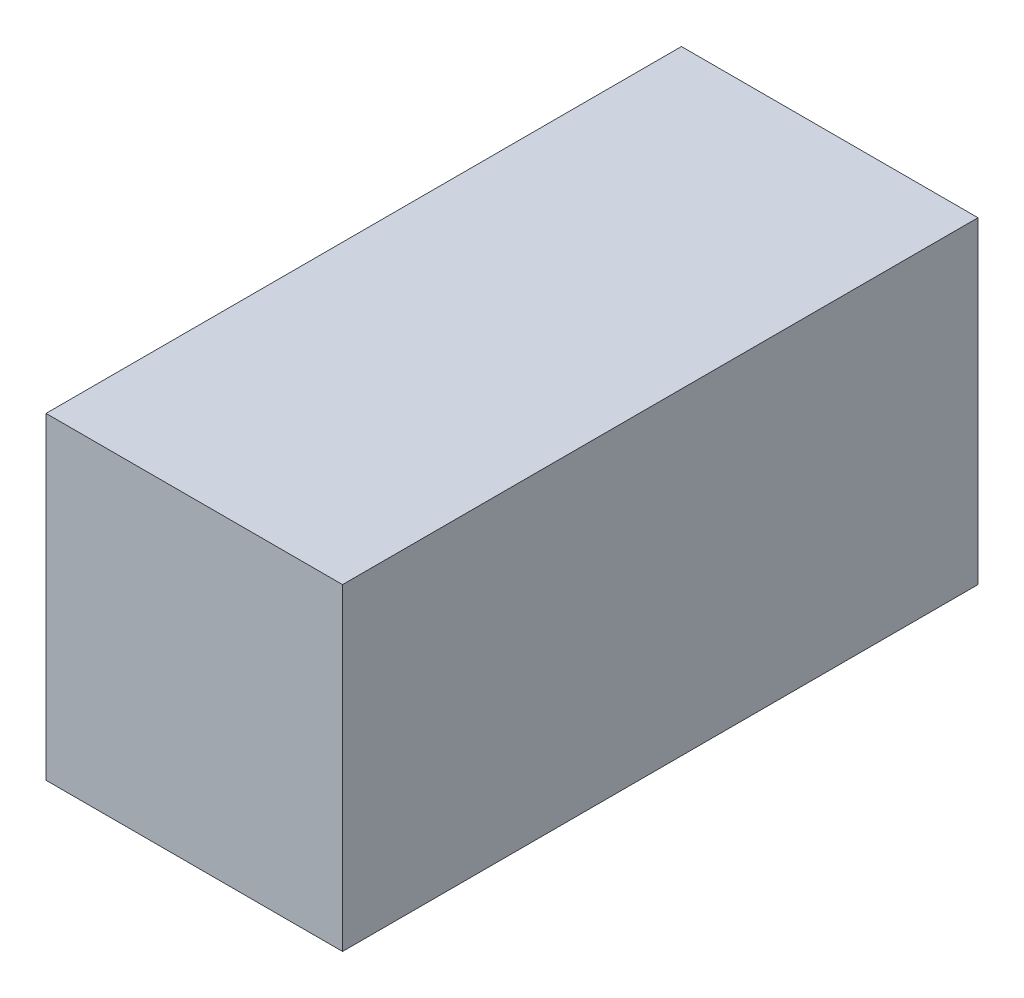
ISO-10303-21;
HEADER;
FILE_DESCRIPTION(('STEP AP214'),'2;1');
FILE_NAME('part.step','',(''),(''),'','','');
FILE_SCHEMA(('AUTOMOTIVE_DESIGN { 1 0 10303 214 1 1 1 1 }'));
ENDSEC;
DATA;
#1=APPLICATION_CONTEXT('core data for automotive mechanical design processes');
#2=APPLICATION_PROTOCOL_DEFINITION('international standard','automotive_design',2000,#1);
#3=PRODUCT_CONTEXT('',#1,'mechanical');
#4=PRODUCT('Part','Part','',(#3));
#5=PRODUCT_RELATED_PRODUCT_CATEGORY('part','',(#4));
#6=PRODUCT_DEFINITION_FORMATION('','',#4);
#7=PRODUCT_DEFINITION_CONTEXT('part definition',#1,'design');
#8=PRODUCT_DEFINITION('design','',#6,#7);
#9=PRODUCT_DEFINITION_SHAPE('','',#8);
#10=(LENGTH_UNIT() NAMED_UNIT(*) SI_UNIT(.MILLI.,.METRE.));
#11=(NAMED_UNIT(*) PLANE_ANGLE_UNIT() SI_UNIT($,.RADIAN.));
#12=(NAMED_UNIT(*) SI_UNIT($,.STERADIAN.) SOLID_ANGLE_UNIT());
#13=UNCERTAINTY_MEASURE_WITH_UNIT(LENGTH_MEASURE(1.E-05),#10,'distance_accuracy_value','');
#14=(GEOMETRIC_REPRESENTATION_CONTEXT(3) GLOBAL_UNCERTAINTY_ASSIGNED_CONTEXT((#13)) GLOBAL_UNIT_ASSIGNED_CONTEXT((#10,
#11,#12)) REPRESENTATION_CONTEXT('',''));
#15=CARTESIAN_POINT('',(0.,0.,0.));
#16=DIRECTION('',(0.,0.,1.));
#17=DIRECTION('',(1.,0.,0.));
#18=AXIS2_PLACEMENT_3D('',#15,#16,#17);
#19=CARTESIAN_POINT('',(230.,405.,-400.));
#20=DIRECTION('',(-1.,0.,0.));
#21=DIRECTION('',(0.,0.,1.));
#22=AXIS2_PLACEMENT_3D('',#19,#20,#21);
#23=PLANE('',#22);
#24=DIRECTION('',(0.,-1.,0.));
#25=VECTOR('',#24,1.);
#26=CARTESIAN_POINT('',(230.,405.,-100.));
#27=LINE('',#26,#25);
#28=CARTESIAN_POINT('',(230.,555.,-100.));
#29=VERTEX_POINT('',#28);
#30=CARTESIAN_POINT('',(230.,405.,-100.));
#31=VERTEX_POINT('',#30);
#32=EDGE_CURVE('E103',#29,#31,#27,.T.);
#33=ORIENTED_EDGE('',*,*,#32,.F.);
#34=DIRECTION('',(0.,0.,1.));
#35=VECTOR('',#34,1.);
#36=CARTESIAN_POINT('',(230.,555.,-400.));
#37=LINE('',#36,#35);
#38=CARTESIAN_POINT('',(230.,555.,-400.));
#39=VERTEX_POINT('',#38);
#40=EDGE_CURVE('E11',#39,#29,#37,.T.);
#41=ORIENTED_EDGE('',*,*,#40,.F.);
#42=DIRECTION('',(0.,-1.,0.));
#43=VECTOR('',#42,1.);
#44=CARTESIAN_POINT('',(230.,405.,-400.));
#45=LINE('',#44,#43);
#46=CARTESIAN_POINT('',(230.,405.,-400.));
#47=VERTEX_POINT('',#46);
#48=EDGE_CURVE('E97',#39,#47,#45,.T.);
#49=ORIENTED_EDGE('',*,*,#48,.T.);
#50=DIRECTION('',(0.,0.,1.));
#51=VECTOR('',#50,1.);
#52=CARTESIAN_POINT('',(230.,405.,-400.));
#53=LINE('',#52,#51);
#54=EDGE_CURVE('E42',#47,#31,#53,.T.);
#55=ORIENTED_EDGE('',*,*,#54,.T.);
#56=EDGE_LOOP('',(#33,#41,#49,#55));
#57=FACE_BOUND('',#56,.T.);
#58=ADVANCED_FACE('F39',(#57),#23,.T.);
#59=CARTESIAN_POINT('',(230.,555.,-400.));
#60=DIRECTION('',(0.,1.,0.));
#61=DIRECTION('',(0.,0.,1.));
#62=AXIS2_PLACEMENT_3D('',#59,#60,#61);
#63=PLANE('',#62);
#64=DIRECTION('',(-1.,0.,0.));
#65=VECTOR('',#64,1.);
#66=CARTESIAN_POINT('',(230.,555.,-100.));
#67=LINE('',#66,#65);
#68=CARTESIAN_POINT('',(370.,555.,-100.));
#69=VERTEX_POINT('',#68);
#70=EDGE_CURVE('E99',#69,#29,#67,.T.);
#71=ORIENTED_EDGE('',*,*,#70,.F.);
#72=DIRECTION('',(0.,0.,1.));
#73=VECTOR('',#72,1.);
#74=CARTESIAN_POINT('',(370.,555.,-400.));
#75=LINE('',#74,#73);
#76=CARTESIAN_POINT('',(370.,555.,-400.));
#77=VERTEX_POINT('',#76);
#78=EDGE_CURVE('E48',#77,#69,#75,.T.);
#79=ORIENTED_EDGE('',*,*,#78,.F.);
#80=DIRECTION('',(-1.,0.,0.));
#81=VECTOR('',#80,1.);
#82=CARTESIAN_POINT('',(230.,555.,-400.));
#83=LINE('',#82,#81);
#84=EDGE_CURVE('E94',#77,#39,#83,.T.);
#85=ORIENTED_EDGE('',*,*,#84,.T.);
#86=ORIENTED_EDGE('',*,*,#40,.T.);
#87=EDGE_LOOP('',(#71,#79,#85,#86));
#88=FACE_BOUND('',#87,.T.);
#89=ADVANCED_FACE('F113',(#88),#63,.T.);
#90=CARTESIAN_POINT('',(370.,405.,-400.));
#91=DIRECTION('',(1.,0.,0.));
#92=DIRECTION('',(0.,0.,-1.));
#93=AXIS2_PLACEMENT_3D('',#90,#91,#92);
#94=PLANE('',#93);
#95=DIRECTION('',(0.,1.,0.));
#96=VECTOR('',#95,1.);
#97=CARTESIAN_POINT('',(370.,405.,-100.));
#98=LINE('',#97,#96);
#99=CARTESIAN_POINT('',(370.,405.,-100.));
#100=VERTEX_POINT('',#99);
#101=EDGE_CURVE('E89',#100,#69,#98,.T.);
#102=ORIENTED_EDGE('',*,*,#101,.F.);
#103=DIRECTION('',(0.,0.,1.));
#104=VECTOR('',#103,1.);
#105=CARTESIAN_POINT('',(370.,405.,-400.));
#106=LINE('',#105,#104);
#107=CARTESIAN_POINT('',(370.,405.,-400.));
#108=VERTEX_POINT('',#107);
#109=EDGE_CURVE('E84',#108,#100,#106,.T.);
#110=ORIENTED_EDGE('',*,*,#109,.F.);
#111=DIRECTION('',(0.,1.,0.));
#112=VECTOR('',#111,1.);
#113=CARTESIAN_POINT('',(370.,405.,-400.));
#114=LINE('',#113,#112);
#115=EDGE_CURVE('E87',#108,#77,#114,.T.);
#116=ORIENTED_EDGE('',*,*,#115,.T.);
#117=ORIENTED_EDGE('',*,*,#78,.T.);
#118=EDGE_LOOP('',(#102,#110,#116,#117));
#119=FACE_BOUND('',#118,.T.);
#120=ADVANCED_FACE('F86',(#119),#94,.T.);
#121=CARTESIAN_POINT('',(230.,405.,-400.));
#122=DIRECTION('',(0.,-1.,0.));
#123=DIRECTION('',(0.,0.,-1.));
#124=AXIS2_PLACEMENT_3D('',#121,#122,#123);
#125=PLANE('',#124);
#126=DIRECTION('',(1.,0.,0.));
#127=VECTOR('',#126,1.);
#128=CARTESIAN_POINT('',(230.,405.,-100.));
#129=LINE('',#128,#127);
#130=EDGE_CURVE('E106',#31,#100,#129,.T.);
#131=ORIENTED_EDGE('',*,*,#130,.F.);
#132=ORIENTED_EDGE('',*,*,#54,.F.);
#133=DIRECTION('',(1.,0.,0.));
#134=VECTOR('',#133,1.);
#135=CARTESIAN_POINT('',(230.,405.,-400.));
#136=LINE('',#135,#134);
#137=EDGE_CURVE('E93',#47,#108,#136,.T.);
#138=ORIENTED_EDGE('',*,*,#137,.T.);
#139=ORIENTED_EDGE('',*,*,#109,.T.);
#140=EDGE_LOOP('',(#131,#132,#138,#139));
#141=FACE_BOUND('',#140,.T.);
#142=ADVANCED_FACE('F96',(#141),#125,.T.);
#143=CARTESIAN_POINT('',(0.,0.,-400.));
#144=DIRECTION('',(0.,0.,-1.));
#145=DIRECTION('',(-1.,0.,0.));
#146=AXIS2_PLACEMENT_3D('',#143,#144,#145);
#147=PLANE('',#146);
#148=ORIENTED_EDGE('',*,*,#48,.F.);
#149=ORIENTED_EDGE('',*,*,#84,.F.);
#150=ORIENTED_EDGE('',*,*,#115,.F.);
#151=ORIENTED_EDGE('',*,*,#137,.F.);
#152=EDGE_LOOP('',(#148,#149,#150,#151));
#153=FACE_BOUND('',#152,.T.);
#154=ADVANCED_FACE('F92',(#153),#147,.T.);
#155=CARTESIAN_POINT('',(0.,0.,-100.));
#156=DIRECTION('',(0.,0.,-1.));
#157=DIRECTION('',(-1.,0.,0.));
#158=AXIS2_PLACEMENT_3D('',#155,#156,#157);
#159=PLANE('',#158);
#160=ORIENTED_EDGE('',*,*,#32,.T.);
#161=ORIENTED_EDGE('',*,*,#130,.T.);
#162=ORIENTED_EDGE('',*,*,#101,.T.);
#163=ORIENTED_EDGE('',*,*,#70,.T.);
#164=EDGE_LOOP('',(#160,#161,#162,#163));
#165=FACE_BOUND('',#164,.T.);
#166=ADVANCED_FACE('F112',(#165),#159,.F.);
#167=CLOSED_SHELL('',(#58,#89,#120,#142,#154,#166));
#168=MANIFOLD_SOLID_BREP('B2',#167);
#169=ADVANCED_BREP_SHAPE_REPRESENTATION('',(#18,#168),#14);
#170=SHAPE_DEFINITION_REPRESENTATION(#9,#169);
ENDSEC;
END-ISO-10303-21;
